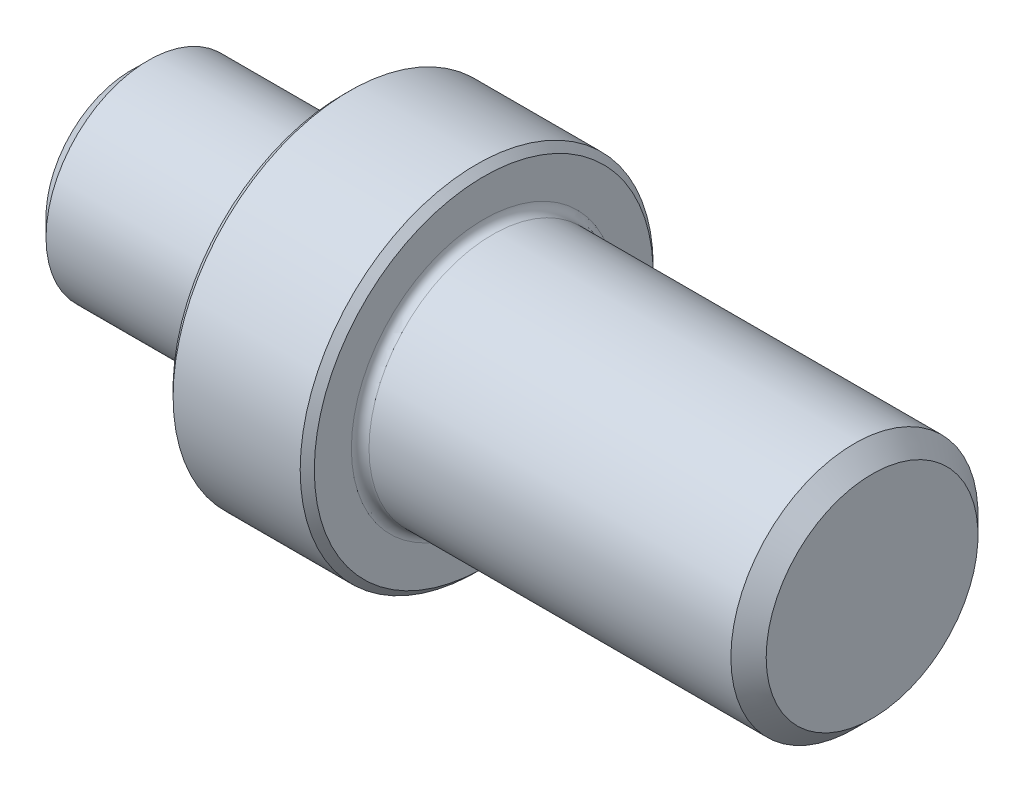
ISO-10303-21;
HEADER;
FILE_DESCRIPTION(('STEP AP214'),'2;1');
FILE_NAME('part.step','',(''),(''),'','','');
FILE_SCHEMA(('AUTOMOTIVE_DESIGN { 1 0 10303 214 1 1 1 1 }'));
ENDSEC;
DATA;
#1=APPLICATION_CONTEXT('core data for automotive mechanical design processes');
#2=APPLICATION_PROTOCOL_DEFINITION('international standard','automotive_design',2000,#1);
#3=PRODUCT_CONTEXT('',#1,'mechanical');
#4=PRODUCT('Part','Part','',(#3));
#5=PRODUCT_RELATED_PRODUCT_CATEGORY('part','',(#4));
#6=PRODUCT_DEFINITION_FORMATION('','',#4);
#7=PRODUCT_DEFINITION_CONTEXT('part definition',#1,'design');
#8=PRODUCT_DEFINITION('design','',#6,#7);
#9=PRODUCT_DEFINITION_SHAPE('','',#8);
#10=(LENGTH_UNIT() NAMED_UNIT(*) SI_UNIT(.MILLI.,.METRE.));
#11=(NAMED_UNIT(*) PLANE_ANGLE_UNIT() SI_UNIT($,.RADIAN.));
#12=(NAMED_UNIT(*) SI_UNIT($,.STERADIAN.) SOLID_ANGLE_UNIT());
#13=UNCERTAINTY_MEASURE_WITH_UNIT(LENGTH_MEASURE(1.E-05),#10,'distance_accuracy_value','');
#14=(GEOMETRIC_REPRESENTATION_CONTEXT(3) GLOBAL_UNCERTAINTY_ASSIGNED_CONTEXT((#13)) GLOBAL_UNIT_ASSIGNED_CONTEXT((#10,
#11,#12)) REPRESENTATION_CONTEXT('',''));
#15=CARTESIAN_POINT('',(0.,0.,0.));
#16=DIRECTION('',(0.,0.,1.));
#17=DIRECTION('',(1.,0.,0.));
#18=AXIS2_PLACEMENT_3D('',#15,#16,#17);
#19=CARTESIAN_POINT('',(0.,0.,0.));
#20=DIRECTION('',(1.,0.,0.));
#21=DIRECTION('',(0.,0.,-1.));
#22=AXIS2_PLACEMENT_3D('',#19,#20,#21);
#23=PLANE('',#22);
#24=CARTESIAN_POINT('',(0.,0.,0.));
#25=DIRECTION('',(1.,0.,0.));
#26=DIRECTION('',(0.,0.,-1.));
#27=AXIS2_PLACEMENT_3D('',#24,#25,#26);
#28=CIRCLE('',#27,24.);
#29=CARTESIAN_POINT('',(0.,0.,-24.));
#30=VERTEX_POINT('',#29);
#31=EDGE_CURVE('E74',#30,#30,#28,.F.);
#32=ORIENTED_EDGE('',*,*,#31,.T.);
#33=EDGE_LOOP('',(#32));
#34=FACE_BOUND('',#33,.T.);
#35=ADVANCED_FACE('F39',(#34),#23,.F.);
#36=CARTESIAN_POINT('',(0.,0.,0.));
#37=DIRECTION('',(-1.,0.,0.));
#38=DIRECTION('',(0.,0.,1.));
#39=AXIS2_PLACEMENT_3D('',#36,#37,#38);
#40=CYLINDRICAL_SURFACE('',#39,29.);
#41=CARTESIAN_POINT('',(57.5,0.,0.));
#42=DIRECTION('',(1.,0.,0.));
#43=DIRECTION('',(0.,0.,-1.));
#44=AXIS2_PLACEMENT_3D('',#41,#42,#43);
#45=CIRCLE('',#44,29.);
#46=CARTESIAN_POINT('',(57.5,0.,-29.));
#47=VERTEX_POINT('',#46);
#48=EDGE_CURVE('E46',#47,#47,#45,.F.);
#49=ORIENTED_EDGE('',*,*,#48,.T.);
#50=EDGE_LOOP('',(#49));
#51=FACE_BOUND('',#50,.T.);
#52=CARTESIAN_POINT('',(4.99999999999995,0.,0.));
#53=DIRECTION('',(1.,0.,0.));
#54=DIRECTION('',(0.,0.,-1.));
#55=AXIS2_PLACEMENT_3D('',#52,#53,#54);
#56=CIRCLE('',#55,29.);
#57=CARTESIAN_POINT('',(4.99999999999995,0.,-29.));
#58=VERTEX_POINT('',#57);
#59=EDGE_CURVE('E71',#58,#58,#56,.T.);
#60=ORIENTED_EDGE('',*,*,#59,.T.);
#61=EDGE_LOOP('',(#60));
#62=FACE_BOUND('',#61,.T.);
#63=ADVANCED_FACE('F105',(#51,#62),#40,.T.);
#64=CARTESIAN_POINT('',(60.,29.,0.));
#65=DIRECTION('',(1.,0.,0.));
#66=DIRECTION('',(0.,0.,-1.));
#67=AXIS2_PLACEMENT_3D('',#64,#65,#66);
#68=PLANE('',#67);
#69=CARTESIAN_POINT('',(60.,0.,0.));
#70=DIRECTION('',(1.,0.,0.));
#71=DIRECTION('',(0.,0.,-1.));
#72=AXIS2_PLACEMENT_3D('',#69,#70,#71);
#73=CIRCLE('',#72,31.5);
#74=CARTESIAN_POINT('',(60.,0.,-31.5));
#75=VERTEX_POINT('',#74);
#76=EDGE_CURVE('E10',#75,#75,#73,.T.);
#77=ORIENTED_EDGE('',*,*,#76,.T.);
#78=EDGE_LOOP('',(#77));
#79=FACE_BOUND('',#78,.T.);
#80=CARTESIAN_POINT('',(60.,0.,0.));
#81=DIRECTION('',(1.,0.,0.));
#82=DIRECTION('',(0.,0.,-1.));
#83=AXIS2_PLACEMENT_3D('',#80,#81,#82);
#84=CIRCLE('',#83,48.);
#85=CARTESIAN_POINT('',(60.,0.,-48.));
#86=VERTEX_POINT('',#85);
#87=EDGE_CURVE('E59',#86,#86,#84,.F.);
#88=ORIENTED_EDGE('',*,*,#87,.T.);
#89=EDGE_LOOP('',(#88));
#90=FACE_BOUND('',#89,.T.);
#91=ADVANCED_FACE('F110',(#79,#90),#68,.F.);
#92=CARTESIAN_POINT('',(0.,0.,0.));
#93=DIRECTION('',(-1.,0.,0.));
#94=DIRECTION('',(0.,0.,1.));
#95=AXIS2_PLACEMENT_3D('',#92,#93,#94);
#96=CYLINDRICAL_SURFACE('',#95,50.);
#97=CARTESIAN_POINT('',(98.,0.,0.));
#98=DIRECTION('',(-1.,0.,0.));
#99=DIRECTION('',(0.,0.,1.));
#100=AXIS2_PLACEMENT_3D('',#97,#98,#99);
#101=CIRCLE('',#100,50.);
#102=CARTESIAN_POINT('',(98.,0.,50.));
#103=VERTEX_POINT('',#102);
#104=EDGE_CURVE('E65',#103,#103,#101,.T.);
#105=ORIENTED_EDGE('',*,*,#104,.T.);
#106=EDGE_LOOP('',(#105));
#107=FACE_BOUND('',#106,.T.);
#108=CARTESIAN_POINT('',(62.,0.,0.));
#109=DIRECTION('',(1.,0.,0.));
#110=DIRECTION('',(0.,0.,-1.));
#111=AXIS2_PLACEMENT_3D('',#108,#109,#110);
#112=CIRCLE('',#111,50.);
#113=CARTESIAN_POINT('',(62.,0.,-50.));
#114=VERTEX_POINT('',#113);
#115=EDGE_CURVE('E68',#114,#114,#112,.T.);
#116=ORIENTED_EDGE('',*,*,#115,.T.);
#117=EDGE_LOOP('',(#116));
#118=FACE_BOUND('',#117,.T.);
#119=ADVANCED_FACE('F115',(#107,#118),#96,.T.);
#120=CARTESIAN_POINT('',(100.,50.,0.));
#121=DIRECTION('',(-1.,0.,0.));
#122=DIRECTION('',(0.,0.,1.));
#123=AXIS2_PLACEMENT_3D('',#120,#121,#122);
#124=PLANE('',#123);
#125=CARTESIAN_POINT('',(100.,0.,0.));
#126=DIRECTION('',(-1.,0.,0.));
#127=DIRECTION('',(0.,0.,1.));
#128=AXIS2_PLACEMENT_3D('',#125,#126,#127);
#129=CIRCLE('',#128,37.5);
#130=CARTESIAN_POINT('',(100.,0.,37.5));
#131=VERTEX_POINT('',#130);
#132=EDGE_CURVE('E54',#131,#131,#129,.T.);
#133=ORIENTED_EDGE('',*,*,#132,.T.);
#134=EDGE_LOOP('',(#133));
#135=FACE_BOUND('',#134,.T.);
#136=CARTESIAN_POINT('',(100.,0.,0.));
#137=DIRECTION('',(-1.,0.,0.));
#138=DIRECTION('',(0.,0.,1.));
#139=AXIS2_PLACEMENT_3D('',#136,#137,#138);
#140=CIRCLE('',#139,48.);
#141=CARTESIAN_POINT('',(100.,0.,48.));
#142=VERTEX_POINT('',#141);
#143=EDGE_CURVE('E62',#142,#142,#140,.F.);
#144=ORIENTED_EDGE('',*,*,#143,.T.);
#145=EDGE_LOOP('',(#144));
#146=FACE_BOUND('',#145,.T.);
#147=ADVANCED_FACE('F118',(#135,#146),#124,.F.);
#148=CARTESIAN_POINT('',(0.,0.,0.));
#149=DIRECTION('',(-1.,0.,0.));
#150=DIRECTION('',(0.,0.,1.));
#151=AXIS2_PLACEMENT_3D('',#148,#149,#150);
#152=CYLINDRICAL_SURFACE('',#151,35.);
#153=CARTESIAN_POINT('',(102.5,0.,0.));
#154=DIRECTION('',(-1.,0.,0.));
#155=DIRECTION('',(0.,0.,1.));
#156=AXIS2_PLACEMENT_3D('',#153,#154,#155);
#157=CIRCLE('',#156,35.);
#158=CARTESIAN_POINT('',(102.5,0.,35.));
#159=VERTEX_POINT('',#158);
#160=EDGE_CURVE('E50',#159,#159,#157,.F.);
#161=ORIENTED_EDGE('',*,*,#160,.T.);
#162=EDGE_LOOP('',(#161));
#163=FACE_BOUND('',#162,.T.);
#164=CARTESIAN_POINT('',(205.,0.,0.));
#165=DIRECTION('',(-1.,0.,0.));
#166=DIRECTION('',(0.,0.,1.));
#167=AXIS2_PLACEMENT_3D('',#164,#165,#166);
#168=CIRCLE('',#167,35.);
#169=CARTESIAN_POINT('',(205.,0.,35.));
#170=VERTEX_POINT('',#169);
#171=EDGE_CURVE('E80',#170,#170,#168,.T.);
#172=ORIENTED_EDGE('',*,*,#171,.T.);
#173=EDGE_LOOP('',(#172));
#174=FACE_BOUND('',#173,.T.);
#175=ADVANCED_FACE('F84',(#163,#174),#152,.T.);
#176=CARTESIAN_POINT('',(210.,35.,0.));
#177=DIRECTION('',(-1.,0.,0.));
#178=DIRECTION('',(0.,0.,1.));
#179=AXIS2_PLACEMENT_3D('',#176,#177,#178);
#180=PLANE('',#179);
#181=CARTESIAN_POINT('',(210.,0.,0.));
#182=DIRECTION('',(-1.,0.,0.));
#183=DIRECTION('',(0.,0.,1.));
#184=AXIS2_PLACEMENT_3D('',#181,#182,#183);
#185=CIRCLE('',#184,30.);
#186=CARTESIAN_POINT('',(210.,0.,30.));
#187=VERTEX_POINT('',#186);
#188=EDGE_CURVE('E77',#187,#187,#185,.F.);
#189=ORIENTED_EDGE('',*,*,#188,.T.);
#190=EDGE_LOOP('',(#189));
#191=FACE_BOUND('',#190,.T.);
#192=ADVANCED_FACE('F89',(#191),#180,.F.);
#193=CARTESIAN_POINT('',(205.,0.,0.));
#194=DIRECTION('',(-1.,0.,0.));
#195=DIRECTION('',(0.,0.,1.));
#196=AXIS2_PLACEMENT_3D('',#193,#194,#195);
#197=CONICAL_SURFACE('',#196,35.,0.785398163397448);
#198=ORIENTED_EDGE('',*,*,#188,.F.);
#199=EDGE_LOOP('',(#198));
#200=FACE_BOUND('',#199,.T.);
#201=ORIENTED_EDGE('',*,*,#171,.F.);
#202=EDGE_LOOP('',(#201));
#203=FACE_BOUND('',#202,.T.);
#204=ADVANCED_FACE('F86',(#200,#203),#197,.T.);
#205=CARTESIAN_POINT('',(0.,0.,0.));
#206=DIRECTION('',(1.,0.,0.));
#207=DIRECTION('',(0.,0.,-1.));
#208=AXIS2_PLACEMENT_3D('',#205,#206,#207);
#209=CONICAL_SURFACE('',#208,24.,0.785398163397449);
#210=ORIENTED_EDGE('',*,*,#59,.F.);
#211=EDGE_LOOP('',(#210));
#212=FACE_BOUND('',#211,.T.);
#213=ORIENTED_EDGE('',*,*,#31,.F.);
#214=EDGE_LOOP('',(#213));
#215=FACE_BOUND('',#214,.T.);
#216=ADVANCED_FACE('F88',(#212,#215),#209,.T.);
#217=CARTESIAN_POINT('',(98.,0.,0.));
#218=DIRECTION('',(-1.,0.,0.));
#219=DIRECTION('',(0.,0.,1.));
#220=AXIS2_PLACEMENT_3D('',#217,#218,#219);
#221=CONICAL_SURFACE('',#220,50.,0.785398163397453);
#222=ORIENTED_EDGE('',*,*,#143,.F.);
#223=EDGE_LOOP('',(#222));
#224=FACE_BOUND('',#223,.T.);
#225=ORIENTED_EDGE('',*,*,#104,.F.);
#226=EDGE_LOOP('',(#225));
#227=FACE_BOUND('',#226,.T.);
#228=ADVANCED_FACE('F96',(#224,#227),#221,.T.);
#229=CARTESIAN_POINT('',(60.,0.,0.));
#230=DIRECTION('',(1.,0.,0.));
#231=DIRECTION('',(0.,0.,-1.));
#232=AXIS2_PLACEMENT_3D('',#229,#230,#231);
#233=CONICAL_SURFACE('',#232,48.,0.785398163397447);
#234=ORIENTED_EDGE('',*,*,#115,.F.);
#235=EDGE_LOOP('',(#234));
#236=FACE_BOUND('',#235,.T.);
#237=ORIENTED_EDGE('',*,*,#87,.F.);
#238=EDGE_LOOP('',(#237));
#239=FACE_BOUND('',#238,.T.);
#240=ADVANCED_FACE('F132',(#236,#239),#233,.T.);
#241=CARTESIAN_POINT('',(102.5,0.,0.));
#242=DIRECTION('',(-1.,0.,0.));
#243=DIRECTION('',(0.,0.,1.));
#244=AXIS2_PLACEMENT_3D('',#241,#242,#243);
#245=TOROIDAL_SURFACE('',#244,37.5,2.5);
#246=ORIENTED_EDGE('',*,*,#160,.F.);
#247=EDGE_LOOP('',(#246));
#248=FACE_BOUND('',#247,.T.);
#249=ORIENTED_EDGE('',*,*,#132,.F.);
#250=EDGE_LOOP('',(#249));
#251=FACE_BOUND('',#250,.T.);
#252=ADVANCED_FACE('F129',(#248,#251),#245,.F.);
#253=CARTESIAN_POINT('',(57.5,0.,0.));
#254=DIRECTION('',(1.,0.,0.));
#255=DIRECTION('',(0.,0.,-1.));
#256=AXIS2_PLACEMENT_3D('',#253,#254,#255);
#257=TOROIDAL_SURFACE('',#256,31.5,2.5);
#258=ORIENTED_EDGE('',*,*,#76,.F.);
#259=EDGE_LOOP('',(#258));
#260=FACE_BOUND('',#259,.T.);
#261=ORIENTED_EDGE('',*,*,#48,.F.);
#262=EDGE_LOOP('',(#261));
#263=FACE_BOUND('',#262,.T.);
#264=ADVANCED_FACE('F41',(#260,#263),#257,.F.);
#265=CLOSED_SHELL('',(#35,#63,#91,#119,#147,#175,#192,#204,#216,#228,#240,#252,#264));
#266=MANIFOLD_SOLID_BREP('B2',#265);
#267=ADVANCED_BREP_SHAPE_REPRESENTATION('',(#18,#266),#14);
#268=SHAPE_DEFINITION_REPRESENTATION(#9,#267);
ENDSEC;
END-ISO-10303-21;
